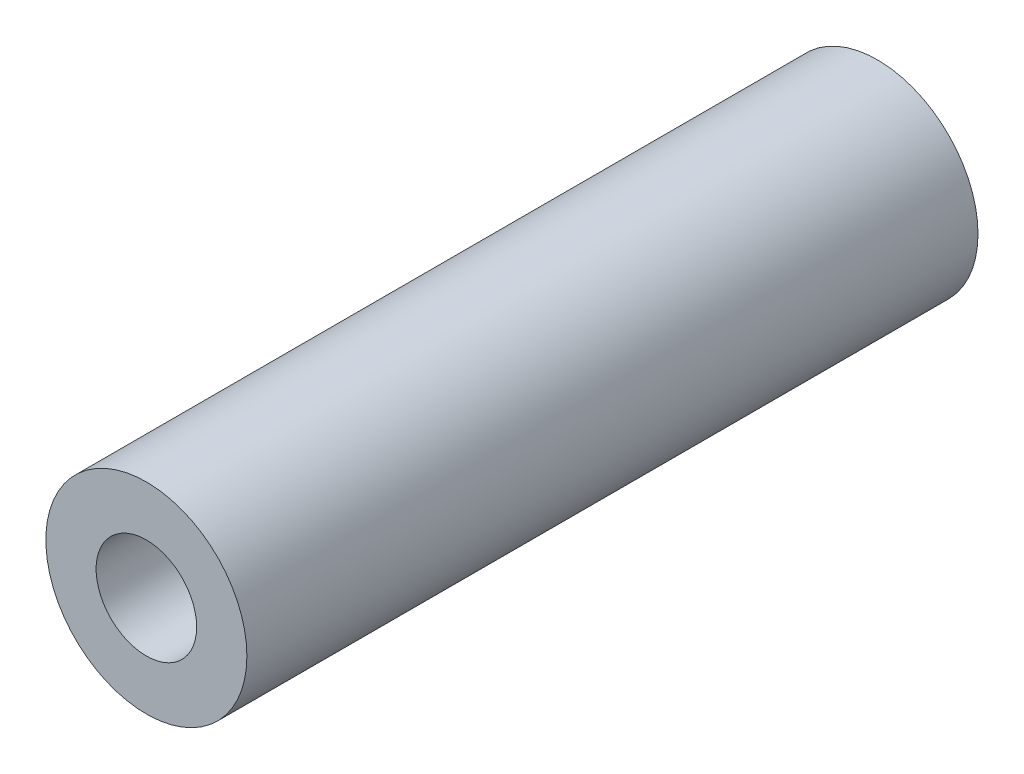
ISO-10303-21;
HEADER;
FILE_DESCRIPTION(('STEP AP214'),'2;1');
FILE_NAME('part.step','',(''),(''),'','','');
FILE_SCHEMA(('AUTOMOTIVE_DESIGN { 1 0 10303 214 1 1 1 1 }'));
ENDSEC;
DATA;
#1=APPLICATION_CONTEXT('core data for automotive mechanical design processes');
#2=APPLICATION_PROTOCOL_DEFINITION('international standard','automotive_design',2000,#1);
#3=PRODUCT_CONTEXT('',#1,'mechanical');
#4=PRODUCT('Part','Part','',(#3));
#5=PRODUCT_RELATED_PRODUCT_CATEGORY('part','',(#4));
#6=PRODUCT_DEFINITION_FORMATION('','',#4);
#7=PRODUCT_DEFINITION_CONTEXT('part definition',#1,'design');
#8=PRODUCT_DEFINITION('design','',#6,#7);
#9=PRODUCT_DEFINITION_SHAPE('','',#8);
#10=(LENGTH_UNIT() NAMED_UNIT(*) SI_UNIT(.MILLI.,.METRE.));
#11=(NAMED_UNIT(*) PLANE_ANGLE_UNIT() SI_UNIT($,.RADIAN.));
#12=(NAMED_UNIT(*) SI_UNIT($,.STERADIAN.) SOLID_ANGLE_UNIT());
#13=UNCERTAINTY_MEASURE_WITH_UNIT(LENGTH_MEASURE(1.E-05),#10,'distance_accuracy_value','');
#14=(GEOMETRIC_REPRESENTATION_CONTEXT(3) GLOBAL_UNCERTAINTY_ASSIGNED_CONTEXT((#13)) GLOBAL_UNIT_ASSIGNED_CONTEXT((#10,
#11,#12)) REPRESENTATION_CONTEXT('',''));
#15=CARTESIAN_POINT('',(0.,0.,0.));
#16=DIRECTION('',(0.,0.,1.));
#17=DIRECTION('',(1.,0.,0.));
#18=AXIS2_PLACEMENT_3D('',#15,#16,#17);
#19=CARTESIAN_POINT('',(0.,0.,40.));
#20=DIRECTION('',(0.,0.,1.));
#21=DIRECTION('',(1.,0.,0.));
#22=AXIS2_PLACEMENT_3D('',#19,#20,#21);
#23=PLANE('',#22);
#24=CARTESIAN_POINT('',(0.,0.,40.));
#25=DIRECTION('',(0.,0.,1.));
#26=DIRECTION('',(1.,0.,0.));
#27=AXIS2_PLACEMENT_3D('',#24,#25,#26);
#28=CIRCLE('',#27,11.);
#29=CARTESIAN_POINT('',(11.,0.,40.));
#30=VERTEX_POINT('',#29);
#31=EDGE_CURVE('E10',#30,#30,#28,.T.);
#32=ORIENTED_EDGE('',*,*,#31,.T.);
#33=EDGE_LOOP('',(#32));
#34=FACE_BOUND('',#33,.T.);
#35=CARTESIAN_POINT('',(0.,0.,40.));
#36=DIRECTION('',(0.,0.,1.));
#37=DIRECTION('',(1.,0.,0.));
#38=AXIS2_PLACEMENT_3D('',#35,#36,#37);
#39=CIRCLE('',#38,5.5);
#40=CARTESIAN_POINT('',(5.5,0.,40.));
#41=VERTEX_POINT('',#40);
#42=EDGE_CURVE('E50',#41,#41,#39,.T.);
#43=ORIENTED_EDGE('',*,*,#42,.F.);
#44=EDGE_LOOP('',(#43));
#45=FACE_BOUND('',#44,.T.);
#46=ADVANCED_FACE('F37',(#34,#45),#23,.T.);
#47=CARTESIAN_POINT('',(0.,0.,-40.));
#48=DIRECTION('',(0.,0.,1.));
#49=DIRECTION('',(1.,0.,0.));
#50=AXIS2_PLACEMENT_3D('',#47,#48,#49);
#51=PLANE('',#50);
#52=CARTESIAN_POINT('',(0.,0.,-40.));
#53=DIRECTION('',(0.,0.,1.));
#54=DIRECTION('',(1.,0.,0.));
#55=AXIS2_PLACEMENT_3D('',#52,#53,#54);
#56=CIRCLE('',#55,11.);
#57=CARTESIAN_POINT('',(11.,0.,-40.));
#58=VERTEX_POINT('',#57);
#59=EDGE_CURVE('E41',#58,#58,#56,.T.);
#60=ORIENTED_EDGE('',*,*,#59,.F.);
#61=EDGE_LOOP('',(#60));
#62=FACE_BOUND('',#61,.T.);
#63=CARTESIAN_POINT('',(0.,0.,-40.));
#64=DIRECTION('',(0.,0.,1.));
#65=DIRECTION('',(1.,0.,0.));
#66=AXIS2_PLACEMENT_3D('',#63,#64,#65);
#67=CIRCLE('',#66,5.5);
#68=CARTESIAN_POINT('',(5.5,0.,-40.));
#69=VERTEX_POINT('',#68);
#70=EDGE_CURVE('E52',#69,#69,#67,.T.);
#71=ORIENTED_EDGE('',*,*,#70,.T.);
#72=EDGE_LOOP('',(#71));
#73=FACE_BOUND('',#72,.T.);
#74=ADVANCED_FACE('F64',(#62,#73),#51,.F.);
#75=CARTESIAN_POINT('',(0.,0.,40.));
#76=DIRECTION('',(0.,0.,-1.));
#77=DIRECTION('',(-1.,0.,0.));
#78=AXIS2_PLACEMENT_3D('',#75,#76,#77);
#79=CYLINDRICAL_SURFACE('',#78,11.);
#80=ORIENTED_EDGE('',*,*,#31,.F.);
#81=EDGE_LOOP('',(#80));
#82=FACE_BOUND('',#81,.T.);
#83=ORIENTED_EDGE('',*,*,#59,.T.);
#84=EDGE_LOOP('',(#83));
#85=FACE_BOUND('',#84,.T.);
#86=ADVANCED_FACE('F39',(#82,#85),#79,.T.);
#87=CARTESIAN_POINT('',(0.,0.,40.));
#88=DIRECTION('',(0.,0.,-1.));
#89=DIRECTION('',(-1.,0.,0.));
#90=AXIS2_PLACEMENT_3D('',#87,#88,#89);
#91=CYLINDRICAL_SURFACE('',#90,5.5);
#92=ORIENTED_EDGE('',*,*,#42,.T.);
#93=EDGE_LOOP('',(#92));
#94=FACE_BOUND('',#93,.T.);
#95=ORIENTED_EDGE('',*,*,#70,.F.);
#96=EDGE_LOOP('',(#95));
#97=FACE_BOUND('',#96,.T.);
#98=ADVANCED_FACE('F60',(#94,#97),#91,.F.);
#99=CLOSED_SHELL('',(#46,#74,#86,#98));
#100=MANIFOLD_SOLID_BREP('B2',#99);
#101=ADVANCED_BREP_SHAPE_REPRESENTATION('',(#18,#100),#14);
#102=SHAPE_DEFINITION_REPRESENTATION(#9,#101);
ENDSEC;
END-ISO-10303-21;
